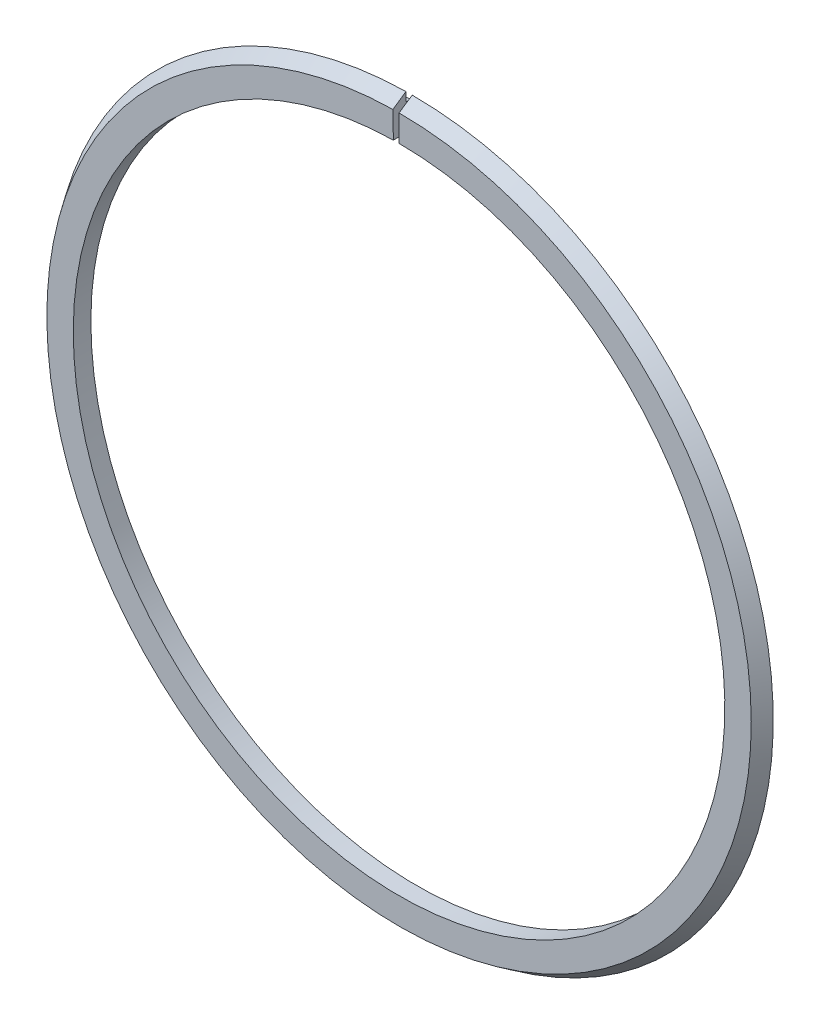
ISO-10303-21;
HEADER;
FILE_DESCRIPTION(('STEP AP214'),'2;1');
FILE_NAME('part.step','',(''),(''),'','','');
FILE_SCHEMA(('AUTOMOTIVE_DESIGN { 1 0 10303 214 1 1 1 1 }'));
ENDSEC;
DATA;
#1=APPLICATION_CONTEXT('core data for automotive mechanical design processes');
#2=APPLICATION_PROTOCOL_DEFINITION('international standard','automotive_design',2000,#1);
#3=PRODUCT_CONTEXT('',#1,'mechanical');
#4=PRODUCT('Part','Part','',(#3));
#5=PRODUCT_RELATED_PRODUCT_CATEGORY('part','',(#4));
#6=PRODUCT_DEFINITION_FORMATION('','',#4);
#7=PRODUCT_DEFINITION_CONTEXT('part definition',#1,'design');
#8=PRODUCT_DEFINITION('design','',#6,#7);
#9=PRODUCT_DEFINITION_SHAPE('','',#8);
#10=(LENGTH_UNIT() NAMED_UNIT(*) SI_UNIT(.MILLI.,.METRE.));
#11=(NAMED_UNIT(*) PLANE_ANGLE_UNIT() SI_UNIT($,.RADIAN.));
#12=(NAMED_UNIT(*) SI_UNIT($,.STERADIAN.) SOLID_ANGLE_UNIT());
#13=UNCERTAINTY_MEASURE_WITH_UNIT(LENGTH_MEASURE(1.E-05),#10,'distance_accuracy_value','');
#14=(GEOMETRIC_REPRESENTATION_CONTEXT(3) GLOBAL_UNCERTAINTY_ASSIGNED_CONTEXT((#13)) GLOBAL_UNIT_ASSIGNED_CONTEXT((#10,
#11,#12)) REPRESENTATION_CONTEXT('',''));
#15=CARTESIAN_POINT('',(0.,0.,0.));
#16=DIRECTION('',(0.,0.,1.));
#17=DIRECTION('',(1.,0.,0.));
#18=AXIS2_PLACEMENT_3D('',#15,#16,#17);
#19=CARTESIAN_POINT('',(0.,0.,0.));
#20=DIRECTION('',(0.,0.,1.));
#21=DIRECTION('',(1.,0.,0.));
#22=AXIS2_PLACEMENT_3D('',#19,#20,#21);
#23=CYLINDRICAL_SURFACE('',#22,37.);
#24=CARTESIAN_POINT('',(0.,0.,0.));
#25=DIRECTION('',(0.,0.,1.));
#26=DIRECTION('',(1.,0.,0.));
#27=AXIS2_PLACEMENT_3D('',#24,#25,#26);
#28=CIRCLE('',#27,37.);
#29=CARTESIAN_POINT('',(-0.645739038178966,36.9943647207865,0.));
#30=VERTEX_POINT('',#29);
#31=CARTESIAN_POINT('',(0.,37.,0.));
#32=VERTEX_POINT('',#31);
#33=EDGE_CURVE('E11',#30,#32,#28,.T.);
#34=ORIENTED_EDGE('',*,*,#33,.T.);
#35=DIRECTION('',(0.,0.,1.));
#36=VECTOR('',#35,1.);
#37=CARTESIAN_POINT('',(0.,37.,0.));
#38=LINE('',#37,#36);
#39=CARTESIAN_POINT('',(0.,37.,-2.));
#40=VERTEX_POINT('',#39);
#41=EDGE_CURVE('E95',#40,#32,#38,.T.);
#42=ORIENTED_EDGE('',*,*,#41,.F.);
#43=CARTESIAN_POINT('',(0.,0.,-2.));
#44=DIRECTION('',(0.,0.,1.));
#45=DIRECTION('',(1.,0.,0.));
#46=AXIS2_PLACEMENT_3D('',#43,#44,#45);
#47=CIRCLE('',#46,37.);
#48=CARTESIAN_POINT('',(-0.645739038178966,36.9943647207865,-2.));
#49=VERTEX_POINT('',#48);
#50=EDGE_CURVE('E58',#49,#40,#47,.T.);
#51=ORIENTED_EDGE('',*,*,#50,.F.);
#52=DIRECTION('',(0.,0.,1.));
#53=VECTOR('',#52,1.);
#54=CARTESIAN_POINT('',(-0.645739038178966,36.9943647207865,0.));
#55=LINE('',#54,#53);
#56=EDGE_CURVE('E97',#49,#30,#55,.T.);
#57=ORIENTED_EDGE('',*,*,#56,.T.);
#58=EDGE_LOOP('',(#34,#42,#51,#57));
#59=FACE_BOUND('',#58,.T.);
#60=ADVANCED_FACE('F43',(#59),#23,.F.);
#61=CARTESIAN_POINT('',(-0.645739038178966,36.9943647207865,0.));
#62=DIRECTION('',(0.,0.,1.));
#63=DIRECTION('',(1.,0.,0.));
#64=AXIS2_PLACEMENT_3D('',#61,#62,#63);
#65=PLANE('',#64);
#66=CARTESIAN_POINT('',(0.,0.,0.));
#67=DIRECTION('',(0.,0.,1.));
#68=DIRECTION('',(1.,0.,0.));
#69=AXIS2_PLACEMENT_3D('',#66,#67,#68);
#70=CIRCLE('',#69,40.);
#71=CARTESIAN_POINT('',(-0.698096257490774,39.9939078062557,0.));
#72=VERTEX_POINT('',#71);
#73=CARTESIAN_POINT('',(0.,40.,0.));
#74=VERTEX_POINT('',#73);
#75=EDGE_CURVE('E51',#72,#74,#70,.T.);
#76=ORIENTED_EDGE('',*,*,#75,.T.);
#77=DIRECTION('',(0.,1.,0.));
#78=VECTOR('',#77,1.);
#79=CARTESIAN_POINT('',(0.,37.,0.));
#80=LINE('',#79,#78);
#81=EDGE_CURVE('E106',#32,#74,#80,.T.);
#82=ORIENTED_EDGE('',*,*,#81,.F.);
#83=ORIENTED_EDGE('',*,*,#33,.F.);
#84=DIRECTION('',(-0.0174524064372693,0.999847695156391,0.));
#85=VECTOR('',#84,1.);
#86=CARTESIAN_POINT('',(-0.645739038178966,36.9943647207865,0.));
#87=LINE('',#86,#85);
#88=EDGE_CURVE('E122',#30,#72,#87,.T.);
#89=ORIENTED_EDGE('',*,*,#88,.T.);
#90=EDGE_LOOP('',(#76,#82,#83,#89));
#91=FACE_BOUND('',#90,.T.);
#92=ADVANCED_FACE('F45',(#91),#65,.T.);
#93=CARTESIAN_POINT('',(0.,0.,0.));
#94=DIRECTION('',(0.,0.,-1.));
#95=DIRECTION('',(-1.,0.,0.));
#96=AXIS2_PLACEMENT_3D('',#93,#94,#95);
#97=CONICAL_SURFACE('',#96,40.,0.588002603547565);
#98=CARTESIAN_POINT('',(0.,0.,-1.5));
#99=DIRECTION('',(0.,0.,1.));
#100=DIRECTION('',(1.,0.,0.));
#101=AXIS2_PLACEMENT_3D('',#98,#99,#100);
#102=CIRCLE('',#101,41.);
#103=CARTESIAN_POINT('',(-0.715548663928043,40.993755501412,-1.5));
#104=VERTEX_POINT('',#103);
#105=CARTESIAN_POINT('',(0.,41.,-1.5));
#106=VERTEX_POINT('',#105);
#107=EDGE_CURVE('E138',#104,#106,#102,.T.);
#108=ORIENTED_EDGE('',*,*,#107,.T.);
#109=DIRECTION('',(0.,0.554700196225227,-0.832050294337845));
#110=VECTOR('',#109,1.);
#111=CARTESIAN_POINT('',(0.,40.,0.));
#112=LINE('',#111,#110);
#113=EDGE_CURVE('E111',#74,#106,#112,.T.);
#114=ORIENTED_EDGE('',*,*,#113,.F.);
#115=ORIENTED_EDGE('',*,*,#75,.F.);
#116=DIRECTION('',(-0.00968085327535572,0.554615712698591,-0.832050294337845));
#117=VECTOR('',#116,1.);
#118=CARTESIAN_POINT('',(-0.698096257490774,39.9939078062557,0.));
#119=LINE('',#118,#117);
#120=EDGE_CURVE('E124',#72,#104,#119,.T.);
#121=ORIENTED_EDGE('',*,*,#120,.T.);
#122=EDGE_LOOP('',(#108,#114,#115,#121));
#123=FACE_BOUND('',#122,.T.);
#124=ADVANCED_FACE('F140',(#123),#97,.T.);
#125=CARTESIAN_POINT('',(-0.698096257490774,39.9939078062557,-1.5));
#126=DIRECTION('',(0.,0.,-1.));
#127=DIRECTION('',(-1.,0.,0.));
#128=AXIS2_PLACEMENT_3D('',#125,#126,#127);
#129=PLANE('',#128);
#130=CARTESIAN_POINT('',(0.,0.,-1.5));
#131=DIRECTION('',(0.,0.,1.));
#132=DIRECTION('',(1.,0.,0.));
#133=AXIS2_PLACEMENT_3D('',#130,#131,#132);
#134=CIRCLE('',#133,40.);
#135=CARTESIAN_POINT('',(-0.698096257490774,39.9939078062557,-1.5));
#136=VERTEX_POINT('',#135);
#137=CARTESIAN_POINT('',(0.,40.,-1.5));
#138=VERTEX_POINT('',#137);
#139=EDGE_CURVE('E136',#136,#138,#134,.T.);
#140=ORIENTED_EDGE('',*,*,#139,.T.);
#141=DIRECTION('',(0.,-1.,0.));
#142=VECTOR('',#141,1.);
#143=CARTESIAN_POINT('',(0.,40.,-1.5));
#144=LINE('',#143,#142);
#145=EDGE_CURVE('E113',#106,#138,#144,.T.);
#146=ORIENTED_EDGE('',*,*,#145,.F.);
#147=ORIENTED_EDGE('',*,*,#107,.F.);
#148=DIRECTION('',(0.0174524064372693,-0.999847695156391,0.));
#149=VECTOR('',#148,1.);
#150=CARTESIAN_POINT('',(-0.698096257490774,39.9939078062557,-1.5));
#151=LINE('',#150,#149);
#152=EDGE_CURVE('E127',#104,#136,#151,.T.);
#153=ORIENTED_EDGE('',*,*,#152,.T.);
#154=EDGE_LOOP('',(#140,#146,#147,#153));
#155=FACE_BOUND('',#154,.T.);
#156=ADVANCED_FACE('F146',(#155),#129,.T.);
#157=CARTESIAN_POINT('',(0.,0.,0.));
#158=DIRECTION('',(0.,0.,1.));
#159=DIRECTION('',(1.,0.,0.));
#160=AXIS2_PLACEMENT_3D('',#157,#158,#159);
#161=CYLINDRICAL_SURFACE('',#160,40.);
#162=CARTESIAN_POINT('',(0.,0.,-2.));
#163=DIRECTION('',(0.,0.,1.));
#164=DIRECTION('',(1.,0.,0.));
#165=AXIS2_PLACEMENT_3D('',#162,#163,#164);
#166=CIRCLE('',#165,40.);
#167=CARTESIAN_POINT('',(-0.698096257490774,39.9939078062557,-2.));
#168=VERTEX_POINT('',#167);
#169=CARTESIAN_POINT('',(0.,40.,-2.));
#170=VERTEX_POINT('',#169);
#171=EDGE_CURVE('E66',#168,#170,#166,.T.);
#172=ORIENTED_EDGE('',*,*,#171,.T.);
#173=DIRECTION('',(0.,0.,-1.));
#174=VECTOR('',#173,1.);
#175=CARTESIAN_POINT('',(0.,40.,-1.5));
#176=LINE('',#175,#174);
#177=EDGE_CURVE('E118',#138,#170,#176,.T.);
#178=ORIENTED_EDGE('',*,*,#177,.F.);
#179=ORIENTED_EDGE('',*,*,#139,.F.);
#180=DIRECTION('',(0.,0.,-1.));
#181=VECTOR('',#180,1.);
#182=CARTESIAN_POINT('',(-0.698096257490774,39.9939078062557,-1.5));
#183=LINE('',#182,#181);
#184=EDGE_CURVE('E130',#136,#168,#183,.T.);
#185=ORIENTED_EDGE('',*,*,#184,.T.);
#186=EDGE_LOOP('',(#172,#178,#179,#185));
#187=FACE_BOUND('',#186,.T.);
#188=ADVANCED_FACE('F149',(#187),#161,.T.);
#189=CARTESIAN_POINT('',(-0.698096257490774,39.9939078062557,-2.));
#190=DIRECTION('',(0.,0.,-1.));
#191=DIRECTION('',(-1.,0.,0.));
#192=AXIS2_PLACEMENT_3D('',#189,#190,#191);
#193=PLANE('',#192);
#194=DIRECTION('',(0.0174524064372693,-0.999847695156391,0.));
#195=VECTOR('',#194,1.);
#196=CARTESIAN_POINT('',(-0.698096257490774,39.9939078062557,-2.));
#197=LINE('',#196,#195);
#198=EDGE_CURVE('E132',#168,#49,#197,.T.);
#199=ORIENTED_EDGE('',*,*,#198,.T.);
#200=ORIENTED_EDGE('',*,*,#50,.T.);
#201=DIRECTION('',(0.,-1.,0.));
#202=VECTOR('',#201,1.);
#203=CARTESIAN_POINT('',(0.,40.,-2.));
#204=LINE('',#203,#202);
#205=EDGE_CURVE('E109',#170,#40,#204,.T.);
#206=ORIENTED_EDGE('',*,*,#205,.F.);
#207=ORIENTED_EDGE('',*,*,#171,.F.);
#208=EDGE_LOOP('',(#199,#200,#206,#207));
#209=FACE_BOUND('',#208,.T.);
#210=ADVANCED_FACE('F151',(#209),#193,.T.);
#211=CARTESIAN_POINT('',(0.,0.,0.));
#212=DIRECTION('',(-0.999847695156391,-0.0174524064372693,0.));
#213=DIRECTION('',(0.,0.,1.));
#214=AXIS2_PLACEMENT_3D('',#211,#212,#213);
#215=PLANE('',#214);
#216=ORIENTED_EDGE('',*,*,#56,.F.);
#217=ORIENTED_EDGE('',*,*,#198,.F.);
#218=ORIENTED_EDGE('',*,*,#184,.F.);
#219=ORIENTED_EDGE('',*,*,#152,.F.);
#220=ORIENTED_EDGE('',*,*,#120,.F.);
#221=ORIENTED_EDGE('',*,*,#88,.F.);
#222=EDGE_LOOP('',(#216,#217,#218,#219,#220,#221));
#223=FACE_BOUND('',#222,.T.);
#224=ADVANCED_FACE('F153',(#223),#215,.F.);
#225=CARTESIAN_POINT('',(0.,0.,0.));
#226=DIRECTION('',(-1.,0.,0.));
#227=DIRECTION('',(0.,0.,1.));
#228=AXIS2_PLACEMENT_3D('',#225,#226,#227);
#229=PLANE('',#228);
#230=ORIENTED_EDGE('',*,*,#41,.T.);
#231=ORIENTED_EDGE('',*,*,#81,.T.);
#232=ORIENTED_EDGE('',*,*,#113,.T.);
#233=ORIENTED_EDGE('',*,*,#145,.T.);
#234=ORIENTED_EDGE('',*,*,#177,.T.);
#235=ORIENTED_EDGE('',*,*,#205,.T.);
#236=EDGE_LOOP('',(#230,#231,#232,#233,#234,#235));
#237=FACE_BOUND('',#236,.T.);
#238=ADVANCED_FACE('F104',(#237),#229,.T.);
#239=CLOSED_SHELL('',(#60,#92,#124,#156,#188,#210,#224,#238));
#240=MANIFOLD_SOLID_BREP('B2',#239);
#241=ADVANCED_BREP_SHAPE_REPRESENTATION('',(#18,#240),#14);
#242=SHAPE_DEFINITION_REPRESENTATION(#9,#241);
ENDSEC;
END-ISO-10303-21;
